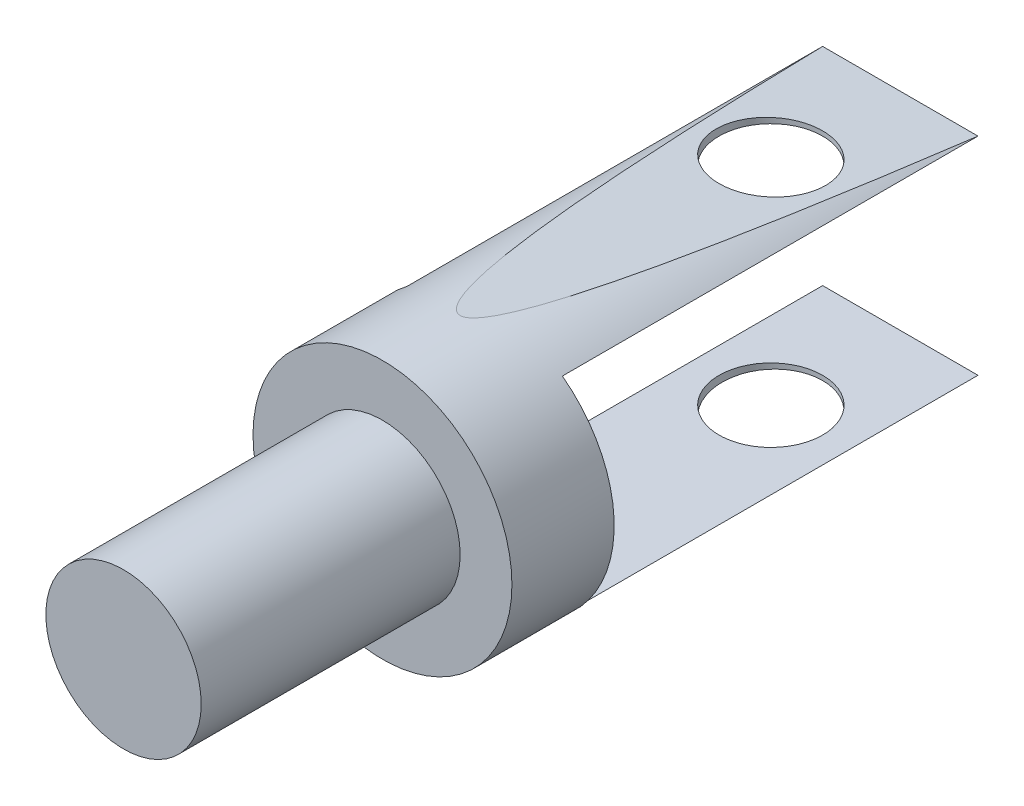
ISO-10303-21;
HEADER;
FILE_DESCRIPTION(('STEP AP214'),'2;1');
FILE_NAME('part.step','',(''),(''),'','','');
FILE_SCHEMA(('AUTOMOTIVE_DESIGN { 1 0 10303 214 1 1 1 1 }'));
ENDSEC;
DATA;
#1=APPLICATION_CONTEXT('core data for automotive mechanical design processes');
#2=APPLICATION_PROTOCOL_DEFINITION('international standard','automotive_design',2000,#1);
#3=PRODUCT_CONTEXT('',#1,'mechanical');
#4=PRODUCT('Part','Part','',(#3));
#5=PRODUCT_RELATED_PRODUCT_CATEGORY('part','',(#4));
#6=PRODUCT_DEFINITION_FORMATION('','',#4);
#7=PRODUCT_DEFINITION_CONTEXT('part definition',#1,'design');
#8=PRODUCT_DEFINITION('design','',#6,#7);
#9=PRODUCT_DEFINITION_SHAPE('','',#8);
#10=(LENGTH_UNIT() NAMED_UNIT(*) SI_UNIT(.MILLI.,.METRE.));
#11=(NAMED_UNIT(*) PLANE_ANGLE_UNIT() SI_UNIT($,.RADIAN.));
#12=(NAMED_UNIT(*) SI_UNIT($,.STERADIAN.) SOLID_ANGLE_UNIT());
#13=UNCERTAINTY_MEASURE_WITH_UNIT(LENGTH_MEASURE(1.E-05),#10,'distance_accuracy_value','');
#14=(GEOMETRIC_REPRESENTATION_CONTEXT(3) GLOBAL_UNCERTAINTY_ASSIGNED_CONTEXT((#13)) GLOBAL_UNIT_ASSIGNED_CONTEXT((#10,
#11,#12)) REPRESENTATION_CONTEXT('',''));
#15=CARTESIAN_POINT('',(0.,0.,0.));
#16=DIRECTION('',(0.,0.,1.));
#17=DIRECTION('',(1.,0.,0.));
#18=AXIS2_PLACEMENT_3D('',#15,#16,#17);
#19=CARTESIAN_POINT('',(0.,0.,20.));
#20=DIRECTION('',(0.,0.,-1.));
#21=DIRECTION('',(-1.,0.,0.));
#22=AXIS2_PLACEMENT_3D('',#19,#20,#21);
#23=CYLINDRICAL_SURFACE('',#22,5.);
#24=CARTESIAN_POINT('',(0.,0.,20.));
#25=DIRECTION('',(0.,0.,1.));
#26=DIRECTION('',(1.,0.,0.));
#27=AXIS2_PLACEMENT_3D('',#24,#25,#26);
#28=CIRCLE('',#27,5.);
#29=CARTESIAN_POINT('',(5.,0.,20.));
#30=VERTEX_POINT('',#29);
#31=EDGE_CURVE('E105',#30,#30,#28,.T.);
#32=ORIENTED_EDGE('',*,*,#31,.F.);
#33=EDGE_LOOP('',(#32));
#34=FACE_BOUND('',#33,.T.);
#35=CARTESIAN_POINT('',(0.,0.,16.0513271377513));
#36=DIRECTION('',(0.,0.,1.));
#37=DIRECTION('',(1.,0.,0.));
#38=AXIS2_PLACEMENT_3D('',#35,#36,#37);
#39=CIRCLE('',#38,5.);
#40=CARTESIAN_POINT('',(3.,-4.,16.0513271377513));
#41=VERTEX_POINT('',#40);
#42=CARTESIAN_POINT('',(3.,4.,16.0513271377513));
#43=VERTEX_POINT('',#42);
#44=EDGE_CURVE('E41',#41,#43,#39,.T.);
#45=ORIENTED_EDGE('',*,*,#44,.T.);
#46=DIRECTION('',(0.,0.,-1.));
#47=VECTOR('',#46,1.);
#48=CARTESIAN_POINT('',(3.,4.,20.));
#49=LINE('',#48,#47);
#50=CARTESIAN_POINT('',(3.,4.,0.));
#51=VERTEX_POINT('',#50);
#52=EDGE_CURVE('E93',#43,#51,#49,.T.);
#53=ORIENTED_EDGE('',*,*,#52,.T.);
#54=CARTESIAN_POINT('',(0.,0.,-68.));
#55=DIRECTION('',(0.,-0.998274373174996,0.0587220219514704));
#56=DIRECTION('',(0.,-0.0587220219514704,-0.998274373174996));
#57=AXIS2_PLACEMENT_3D('',#54,#55,#56);
#58=ELLIPSE('',#57,85.146931829632,5.);
#59=CARTESIAN_POINT('',(-3.,4.,0.));
#60=VERTEX_POINT('',#59);
#61=EDGE_CURVE('E90',#51,#60,#58,.T.);
#62=ORIENTED_EDGE('',*,*,#61,.T.);
#63=DIRECTION('',(0.,0.,-1.));
#64=VECTOR('',#63,1.);
#65=CARTESIAN_POINT('',(-3.,4.,20.));
#66=LINE('',#65,#64);
#67=CARTESIAN_POINT('',(-3.,4.,16.0513271377513));
#68=VERTEX_POINT('',#67);
#69=EDGE_CURVE('E79',#60,#68,#66,.F.);
#70=ORIENTED_EDGE('',*,*,#69,.T.);
#71=CARTESIAN_POINT('',(-3.,-4.,16.0513271377513));
#72=VERTEX_POINT('',#71);
#73=EDGE_CURVE('E11',#68,#72,#39,.T.);
#74=ORIENTED_EDGE('',*,*,#73,.T.);
#75=DIRECTION('',(0.,0.,-1.));
#76=VECTOR('',#75,1.);
#77=CARTESIAN_POINT('',(-3.,-4.,20.));
#78=LINE('',#77,#76);
#79=CARTESIAN_POINT('',(-3.,-4.,0.));
#80=VERTEX_POINT('',#79);
#81=EDGE_CURVE('E72',#72,#80,#78,.T.);
#82=ORIENTED_EDGE('',*,*,#81,.T.);
#83=CARTESIAN_POINT('',(0.,0.,-68.));
#84=DIRECTION('',(0.,0.998274373174996,0.0587220219514704));
#85=DIRECTION('',(0.,0.0587220219514704,-0.998274373174996));
#86=AXIS2_PLACEMENT_3D('',#83,#84,#85);
#87=ELLIPSE('',#86,85.146931829632,5.);
#88=CARTESIAN_POINT('',(3.,-4.,0.));
#89=VERTEX_POINT('',#88);
#90=EDGE_CURVE('E95',#80,#89,#87,.T.);
#91=ORIENTED_EDGE('',*,*,#90,.T.);
#92=DIRECTION('',(0.,0.,-1.));
#93=VECTOR('',#92,1.);
#94=CARTESIAN_POINT('',(3.,-4.,20.));
#95=LINE('',#94,#93);
#96=EDGE_CURVE('E48',#89,#41,#95,.F.);
#97=ORIENTED_EDGE('',*,*,#96,.T.);
#98=EDGE_LOOP('',(#45,#53,#62,#70,#74,#82,#91,#97));
#99=FACE_BOUND('',#98,.T.);
#100=ADVANCED_FACE('F33',(#34,#99),#23,.T.);
#101=CARTESIAN_POINT('',(0.,0.,20.));
#102=DIRECTION('',(0.,0.,1.));
#103=DIRECTION('',(1.,0.,0.));
#104=AXIS2_PLACEMENT_3D('',#101,#102,#103);
#105=PLANE('',#104);
#106=CARTESIAN_POINT('',(0.,0.,20.));
#107=DIRECTION('',(0.,0.,1.));
#108=DIRECTION('',(1.,0.,0.));
#109=AXIS2_PLACEMENT_3D('',#106,#107,#108);
#110=CIRCLE('',#109,3.);
#111=CARTESIAN_POINT('',(3.,0.,20.));
#112=VERTEX_POINT('',#111);
#113=EDGE_CURVE('E101',#112,#112,#110,.T.);
#114=ORIENTED_EDGE('',*,*,#113,.F.);
#115=EDGE_LOOP('',(#114));
#116=FACE_BOUND('',#115,.T.);
#117=ORIENTED_EDGE('',*,*,#31,.T.);
#118=EDGE_LOOP('',(#117));
#119=FACE_BOUND('',#118,.T.);
#120=ADVANCED_FACE('F131',(#116,#119),#105,.T.);
#121=CARTESIAN_POINT('',(0.,0.,30.));
#122=DIRECTION('',(0.,0.,-1.));
#123=DIRECTION('',(-1.,0.,0.));
#124=AXIS2_PLACEMENT_3D('',#121,#122,#123);
#125=CYLINDRICAL_SURFACE('',#124,3.);
#126=CARTESIAN_POINT('',(0.,0.,30.));
#127=DIRECTION('',(0.,0.,1.));
#128=DIRECTION('',(1.,0.,0.));
#129=AXIS2_PLACEMENT_3D('',#126,#127,#128);
#130=CIRCLE('',#129,3.);
#131=CARTESIAN_POINT('',(3.,0.,30.));
#132=VERTEX_POINT('',#131);
#133=EDGE_CURVE('E102',#132,#132,#130,.T.);
#134=ORIENTED_EDGE('',*,*,#133,.F.);
#135=EDGE_LOOP('',(#134));
#136=FACE_BOUND('',#135,.T.);
#137=ORIENTED_EDGE('',*,*,#113,.T.);
#138=EDGE_LOOP('',(#137));
#139=FACE_BOUND('',#138,.T.);
#140=ADVANCED_FACE('F126',(#136,#139),#125,.T.);
#141=CARTESIAN_POINT('',(0.,0.,30.));
#142=DIRECTION('',(0.,0.,1.));
#143=DIRECTION('',(1.,0.,0.));
#144=AXIS2_PLACEMENT_3D('',#141,#142,#143);
#145=PLANE('',#144);
#146=ORIENTED_EDGE('',*,*,#133,.T.);
#147=EDGE_LOOP('',(#146));
#148=FACE_BOUND('',#147,.T.);
#149=ADVANCED_FACE('F117',(#148),#145,.T.);
#150=CARTESIAN_POINT('',(-5.,5.,17.));
#151=DIRECTION('',(0.,-0.998274373174996,0.0587220219514704));
#152=DIRECTION('',(0.,-0.0587220219514704,-0.998274373174996));
#153=AXIS2_PLACEMENT_3D('',#150,#151,#152);
#154=PLANE('',#153);
#155=CARTESIAN_POINT('',(0.,4.29411764705882,5.));
#156=DIRECTION('',(0.,-0.998274373174996,0.0587220219514704));
#157=DIRECTION('',(0.,0.0587220219514704,0.998274373174996));
#158=AXIS2_PLACEMENT_3D('',#155,#156,#157);
#159=ELLIPSE('',#158,2.00345721952075,2.);
#160=CARTESIAN_POINT('',(0.,4.41176470588235,7.));
#161=VERTEX_POINT('',#160);
#162=EDGE_CURVE('E222',#161,#161,#159,.T.);
#163=ORIENTED_EDGE('',*,*,#162,.T.);
#164=EDGE_LOOP('',(#163));
#165=FACE_BOUND('',#164,.T.);
#166=DIRECTION('',(1.,0.,0.));
#167=VECTOR('',#166,1.);
#168=CARTESIAN_POINT('',(0.,4.,0.));
#169=LINE('',#168,#167);
#170=EDGE_CURVE('E110',#60,#51,#169,.T.);
#171=ORIENTED_EDGE('',*,*,#170,.F.);
#172=ORIENTED_EDGE('',*,*,#61,.F.);
#173=EDGE_LOOP('',(#171,#172));
#174=FACE_BOUND('',#173,.T.);
#175=ADVANCED_FACE('F114',(#165,#174),#154,.F.);
#176=CARTESIAN_POINT('',(-5.,-4.,0.));
#177=DIRECTION('',(0.,0.998274373174996,0.0587220219514704));
#178=DIRECTION('',(0.,-0.0587220219514704,0.998274373174996));
#179=AXIS2_PLACEMENT_3D('',#176,#177,#178);
#180=PLANE('',#179);
#181=CARTESIAN_POINT('',(0.,-4.29411764705882,5.));
#182=DIRECTION('',(0.,0.998274373174996,0.0587220219514704));
#183=DIRECTION('',(0.,0.0587220219514704,-0.998274373174996));
#184=AXIS2_PLACEMENT_3D('',#181,#182,#183);
#185=ELLIPSE('',#184,2.00345721952075,2.);
#186=CARTESIAN_POINT('',(0.,-4.17647058823529,3.));
#187=VERTEX_POINT('',#186);
#188=EDGE_CURVE('E223',#187,#187,#185,.T.);
#189=ORIENTED_EDGE('',*,*,#188,.T.);
#190=EDGE_LOOP('',(#189));
#191=FACE_BOUND('',#190,.T.);
#192=DIRECTION('',(-1.,0.,0.));
#193=VECTOR('',#192,1.);
#194=CARTESIAN_POINT('',(0.,-4.,0.));
#195=LINE('',#194,#193);
#196=EDGE_CURVE('E77',#89,#80,#195,.T.);
#197=ORIENTED_EDGE('',*,*,#196,.F.);
#198=ORIENTED_EDGE('',*,*,#90,.F.);
#199=EDGE_LOOP('',(#197,#198));
#200=FACE_BOUND('',#199,.T.);
#201=ADVANCED_FACE('F116',(#191,#200),#180,.F.);
#202=CARTESIAN_POINT('',(-5.,4.,16.0513271377513));
#203=DIRECTION('',(0.,0.,1.));
#204=DIRECTION('',(1.,0.,0.));
#205=AXIS2_PLACEMENT_3D('',#202,#203,#204);
#206=PLANE('',#205);
#207=DIRECTION('',(1.,0.,0.));
#208=VECTOR('',#207,1.);
#209=CARTESIAN_POINT('',(-5.,4.,16.0513271377513));
#210=LINE('',#209,#208);
#211=EDGE_CURVE('E85',#68,#43,#210,.T.);
#212=ORIENTED_EDGE('',*,*,#211,.T.);
#213=ORIENTED_EDGE('',*,*,#44,.F.);
#214=DIRECTION('',(1.,0.,0.));
#215=VECTOR('',#214,1.);
#216=CARTESIAN_POINT('',(-5.,-4.,16.0513271377513));
#217=LINE('',#216,#215);
#218=EDGE_CURVE('E75',#72,#41,#217,.T.);
#219=ORIENTED_EDGE('',*,*,#218,.F.);
#220=ORIENTED_EDGE('',*,*,#73,.F.);
#221=EDGE_LOOP('',(#212,#213,#219,#220));
#222=FACE_BOUND('',#221,.T.);
#223=ADVANCED_FACE('F83',(#222),#206,.F.);
#224=CARTESIAN_POINT('',(-5.,4.,0.));
#225=DIRECTION('',(0.,1.,0.));
#226=DIRECTION('',(0.,0.,1.));
#227=AXIS2_PLACEMENT_3D('',#224,#225,#226);
#228=PLANE('',#227);
#229=CARTESIAN_POINT('',(0.,4.,5.));
#230=DIRECTION('',(0.,1.,0.));
#231=DIRECTION('',(0.,0.,1.));
#232=AXIS2_PLACEMENT_3D('',#229,#230,#231);
#233=CIRCLE('',#232,2.);
#234=CARTESIAN_POINT('',(0.,4.,7.));
#235=VERTEX_POINT('',#234);
#236=EDGE_CURVE('E220',#235,#235,#233,.T.);
#237=ORIENTED_EDGE('',*,*,#236,.T.);
#238=EDGE_LOOP('',(#237));
#239=FACE_BOUND('',#238,.T.);
#240=ORIENTED_EDGE('',*,*,#211,.F.);
#241=ORIENTED_EDGE('',*,*,#69,.F.);
#242=ORIENTED_EDGE('',*,*,#170,.T.);
#243=ORIENTED_EDGE('',*,*,#52,.F.);
#244=EDGE_LOOP('',(#240,#241,#242,#243));
#245=FACE_BOUND('',#244,.T.);
#246=ADVANCED_FACE('F112',(#239,#245),#228,.F.);
#247=CARTESIAN_POINT('',(-5.,-4.,16.0513271377513));
#248=DIRECTION('',(0.,-1.,0.));
#249=DIRECTION('',(0.,0.,-1.));
#250=AXIS2_PLACEMENT_3D('',#247,#248,#249);
#251=PLANE('',#250);
#252=CARTESIAN_POINT('',(0.,-4.,5.));
#253=DIRECTION('',(0.,-1.,0.));
#254=DIRECTION('',(0.,0.,-1.));
#255=AXIS2_PLACEMENT_3D('',#252,#253,#254);
#256=CIRCLE('',#255,2.);
#257=CARTESIAN_POINT('',(0.,-4.,3.));
#258=VERTEX_POINT('',#257);
#259=EDGE_CURVE('E36',#258,#258,#256,.T.);
#260=ORIENTED_EDGE('',*,*,#259,.T.);
#261=EDGE_LOOP('',(#260));
#262=FACE_BOUND('',#261,.T.);
#263=ORIENTED_EDGE('',*,*,#218,.T.);
#264=ORIENTED_EDGE('',*,*,#96,.F.);
#265=ORIENTED_EDGE('',*,*,#196,.T.);
#266=ORIENTED_EDGE('',*,*,#81,.F.);
#267=EDGE_LOOP('',(#263,#264,#265,#266));
#268=FACE_BOUND('',#267,.T.);
#269=ADVANCED_FACE('F74',(#262,#268),#251,.F.);
#270=CARTESIAN_POINT('',(0.,-5.,5.));
#271=DIRECTION('',(0.,1.,0.));
#272=DIRECTION('',(0.,0.,1.));
#273=AXIS2_PLACEMENT_3D('',#270,#271,#272);
#274=CYLINDRICAL_SURFACE('',#273,2.);
#275=ORIENTED_EDGE('',*,*,#259,.F.);
#276=EDGE_LOOP('',(#275));
#277=FACE_BOUND('',#276,.T.);
#278=ORIENTED_EDGE('',*,*,#188,.F.);
#279=EDGE_LOOP('',(#278));
#280=FACE_BOUND('',#279,.T.);
#281=ADVANCED_FACE('F194',(#277,#280),#274,.F.);
#282=ORIENTED_EDGE('',*,*,#236,.F.);
#283=EDGE_LOOP('',(#282));
#284=FACE_BOUND('',#283,.T.);
#285=ORIENTED_EDGE('',*,*,#162,.F.);
#286=EDGE_LOOP('',(#285));
#287=FACE_BOUND('',#286,.T.);
#288=ADVANCED_FACE('F204',(#284,#287),#274,.F.);
#289=CLOSED_SHELL('',(#100,#120,#140,#149,#175,#201,#223,#246,#269,#281,#288));
#290=MANIFOLD_SOLID_BREP('B2',#289);
#291=ADVANCED_BREP_SHAPE_REPRESENTATION('',(#18,#290),#14);
#292=SHAPE_DEFINITION_REPRESENTATION(#9,#291);
ENDSEC;
END-ISO-10303-21;
